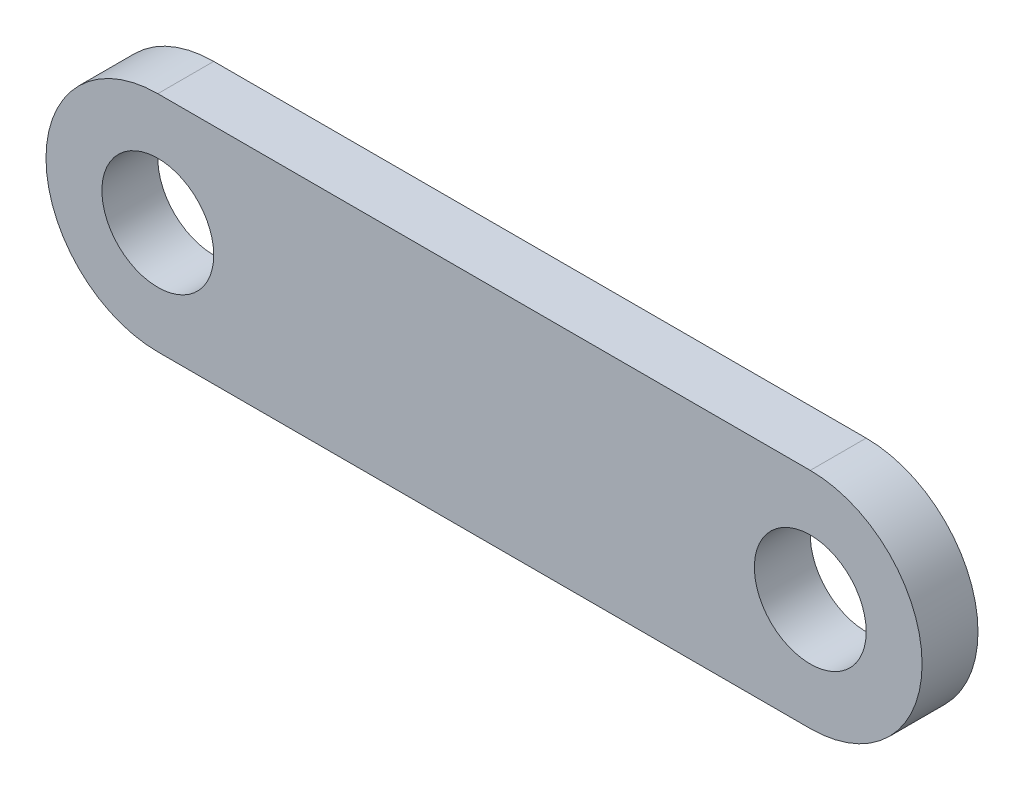
ISO-10303-21;
HEADER;
FILE_DESCRIPTION(('STEP AP214'),'2;1');
FILE_NAME('part.step','',(''),(''),'','','');
FILE_SCHEMA(('AUTOMOTIVE_DESIGN { 1 0 10303 214 1 1 1 1 }'));
ENDSEC;
DATA;
#1=APPLICATION_CONTEXT('core data for automotive mechanical design processes');
#2=APPLICATION_PROTOCOL_DEFINITION('international standard','automotive_design',2000,#1);
#3=PRODUCT_CONTEXT('',#1,'mechanical');
#4=PRODUCT('Part','Part','',(#3));
#5=PRODUCT_RELATED_PRODUCT_CATEGORY('part','',(#4));
#6=PRODUCT_DEFINITION_FORMATION('','',#4);
#7=PRODUCT_DEFINITION_CONTEXT('part definition',#1,'design');
#8=PRODUCT_DEFINITION('design','',#6,#7);
#9=PRODUCT_DEFINITION_SHAPE('','',#8);
#10=(LENGTH_UNIT() NAMED_UNIT(*) SI_UNIT(.MILLI.,.METRE.));
#11=(NAMED_UNIT(*) PLANE_ANGLE_UNIT() SI_UNIT($,.RADIAN.));
#12=(NAMED_UNIT(*) SI_UNIT($,.STERADIAN.) SOLID_ANGLE_UNIT());
#13=UNCERTAINTY_MEASURE_WITH_UNIT(LENGTH_MEASURE(1.E-05),#10,'distance_accuracy_value','');
#14=(GEOMETRIC_REPRESENTATION_CONTEXT(3) GLOBAL_UNCERTAINTY_ASSIGNED_CONTEXT((#13)) GLOBAL_UNIT_ASSIGNED_CONTEXT((#10,
#11,#12)) REPRESENTATION_CONTEXT('',''));
#15=CARTESIAN_POINT('',(0.,0.,0.));
#16=DIRECTION('',(0.,0.,1.));
#17=DIRECTION('',(1.,0.,0.));
#18=AXIS2_PLACEMENT_3D('',#15,#16,#17);
#19=CARTESIAN_POINT('',(5.835,0.,1.));
#20=DIRECTION('',(0.,0.,-1.));
#21=DIRECTION('',(-1.,0.,0.));
#22=AXIS2_PLACEMENT_3D('',#19,#20,#21);
#23=PLANE('',#22);
#24=CARTESIAN_POINT('',(5.835,0.,1.));
#25=DIRECTION('',(0.,0.,1.));
#26=DIRECTION('',(-1.,0.,0.));
#27=AXIS2_PLACEMENT_3D('',#24,#25,#26);
#28=CIRCLE('',#27,2.);
#29=CARTESIAN_POINT('',(5.835,-2.,1.));
#30=VERTEX_POINT('',#29);
#31=CARTESIAN_POINT('',(5.835,2.,1.));
#32=VERTEX_POINT('',#31);
#33=EDGE_CURVE('E95',#30,#32,#28,.T.);
#34=ORIENTED_EDGE('',*,*,#33,.T.);
#35=DIRECTION('',(-1.,0.,0.));
#36=VECTOR('',#35,1.);
#37=CARTESIAN_POINT('',(-5.835,2.,1.));
#38=LINE('',#37,#36);
#39=CARTESIAN_POINT('',(-5.835,2.,1.));
#40=VERTEX_POINT('',#39);
#41=EDGE_CURVE('E90',#32,#40,#38,.T.);
#42=ORIENTED_EDGE('',*,*,#41,.T.);
#43=CARTESIAN_POINT('',(-5.835,0.,1.));
#44=DIRECTION('',(0.,0.,1.));
#45=DIRECTION('',(1.,0.,0.));
#46=AXIS2_PLACEMENT_3D('',#43,#44,#45);
#47=CIRCLE('',#46,2.);
#48=CARTESIAN_POINT('',(-5.835,-2.,1.));
#49=VERTEX_POINT('',#48);
#50=EDGE_CURVE('E93',#40,#49,#47,.T.);
#51=ORIENTED_EDGE('',*,*,#50,.T.);
#52=DIRECTION('',(1.,0.,0.));
#53=VECTOR('',#52,1.);
#54=CARTESIAN_POINT('',(-5.835,-2.,1.));
#55=LINE('',#54,#53);
#56=EDGE_CURVE('E60',#49,#30,#55,.T.);
#57=ORIENTED_EDGE('',*,*,#56,.T.);
#58=EDGE_LOOP('',(#34,#42,#51,#57));
#59=FACE_BOUND('',#58,.T.);
#60=CARTESIAN_POINT('',(-5.835,0.,1.));
#61=DIRECTION('',(0.,0.,1.));
#62=DIRECTION('',(1.,0.,0.));
#63=AXIS2_PLACEMENT_3D('',#60,#61,#62);
#64=CIRCLE('',#63,1.);
#65=CARTESIAN_POINT('',(-4.835,0.,1.));
#66=VERTEX_POINT('',#65);
#67=EDGE_CURVE('E115',#66,#66,#64,.T.);
#68=ORIENTED_EDGE('',*,*,#67,.F.);
#69=EDGE_LOOP('',(#68));
#70=FACE_BOUND('',#69,.T.);
#71=CARTESIAN_POINT('',(5.835,0.,1.));
#72=DIRECTION('',(0.,0.,1.));
#73=DIRECTION('',(1.,0.,0.));
#74=AXIS2_PLACEMENT_3D('',#71,#72,#73);
#75=CIRCLE('',#74,1.);
#76=CARTESIAN_POINT('',(6.835,0.,1.));
#77=VERTEX_POINT('',#76);
#78=EDGE_CURVE('E137',#77,#77,#75,.T.);
#79=ORIENTED_EDGE('',*,*,#78,.F.);
#80=EDGE_LOOP('',(#79));
#81=FACE_BOUND('',#80,.T.);
#82=ADVANCED_FACE('F42',(#59,#70,#81),#23,.F.);
#83=CARTESIAN_POINT('',(5.835,0.,0.));
#84=DIRECTION('',(0.,0.,-1.));
#85=DIRECTION('',(-1.,0.,0.));
#86=AXIS2_PLACEMENT_3D('',#83,#84,#85);
#87=PLANE('',#86);
#88=CARTESIAN_POINT('',(-5.835,0.,0.));
#89=DIRECTION('',(0.,0.,1.));
#90=DIRECTION('',(1.,0.,0.));
#91=AXIS2_PLACEMENT_3D('',#88,#89,#90);
#92=CIRCLE('',#91,1.);
#93=CARTESIAN_POINT('',(-4.835,0.,0.));
#94=VERTEX_POINT('',#93);
#95=EDGE_CURVE('E133',#94,#94,#92,.T.);
#96=ORIENTED_EDGE('',*,*,#95,.T.);
#97=EDGE_LOOP('',(#96));
#98=FACE_BOUND('',#97,.T.);
#99=CARTESIAN_POINT('',(5.835,0.,0.));
#100=DIRECTION('',(0.,0.,1.));
#101=DIRECTION('',(-1.,0.,0.));
#102=AXIS2_PLACEMENT_3D('',#99,#100,#101);
#103=CIRCLE('',#102,2.);
#104=CARTESIAN_POINT('',(5.835,-2.,0.));
#105=VERTEX_POINT('',#104);
#106=CARTESIAN_POINT('',(5.835,2.,0.));
#107=VERTEX_POINT('',#106);
#108=EDGE_CURVE('E111',#105,#107,#103,.T.);
#109=ORIENTED_EDGE('',*,*,#108,.F.);
#110=DIRECTION('',(1.,0.,0.));
#111=VECTOR('',#110,1.);
#112=CARTESIAN_POINT('',(-5.835,-2.,0.));
#113=LINE('',#112,#111);
#114=CARTESIAN_POINT('',(-5.835,-2.,0.));
#115=VERTEX_POINT('',#114);
#116=EDGE_CURVE('E83',#115,#105,#113,.T.);
#117=ORIENTED_EDGE('',*,*,#116,.F.);
#118=CARTESIAN_POINT('',(-5.835,0.,0.));
#119=DIRECTION('',(0.,0.,1.));
#120=DIRECTION('',(1.,0.,0.));
#121=AXIS2_PLACEMENT_3D('',#118,#119,#120);
#122=CIRCLE('',#121,2.);
#123=CARTESIAN_POINT('',(-5.835,2.,0.));
#124=VERTEX_POINT('',#123);
#125=EDGE_CURVE('E77',#124,#115,#122,.T.);
#126=ORIENTED_EDGE('',*,*,#125,.F.);
#127=DIRECTION('',(-1.,0.,0.));
#128=VECTOR('',#127,1.);
#129=CARTESIAN_POINT('',(-5.835,2.,0.));
#130=LINE('',#129,#128);
#131=EDGE_CURVE('E100',#107,#124,#130,.T.);
#132=ORIENTED_EDGE('',*,*,#131,.F.);
#133=EDGE_LOOP('',(#109,#117,#126,#132));
#134=FACE_BOUND('',#133,.T.);
#135=CARTESIAN_POINT('',(5.835,0.,0.));
#136=DIRECTION('',(0.,0.,1.));
#137=DIRECTION('',(1.,0.,0.));
#138=AXIS2_PLACEMENT_3D('',#135,#136,#137);
#139=CIRCLE('',#138,1.);
#140=CARTESIAN_POINT('',(6.835,0.,0.));
#141=VERTEX_POINT('',#140);
#142=EDGE_CURVE('E141',#141,#141,#139,.T.);
#143=ORIENTED_EDGE('',*,*,#142,.T.);
#144=EDGE_LOOP('',(#143));
#145=FACE_BOUND('',#144,.T.);
#146=ADVANCED_FACE('F128',(#98,#134,#145),#87,.T.);
#147=CARTESIAN_POINT('',(5.835,0.,1.));
#148=DIRECTION('',(0.,0.,-1.));
#149=DIRECTION('',(-1.,0.,0.));
#150=AXIS2_PLACEMENT_3D('',#147,#148,#149);
#151=CYLINDRICAL_SURFACE('',#150,2.);
#152=ORIENTED_EDGE('',*,*,#108,.T.);
#153=DIRECTION('',(0.,0.,-1.));
#154=VECTOR('',#153,1.);
#155=CARTESIAN_POINT('',(5.835,2.,1.));
#156=LINE('',#155,#154);
#157=EDGE_CURVE('E11',#32,#107,#156,.T.);
#158=ORIENTED_EDGE('',*,*,#157,.F.);
#159=ORIENTED_EDGE('',*,*,#33,.F.);
#160=DIRECTION('',(0.,0.,-1.));
#161=VECTOR('',#160,1.);
#162=CARTESIAN_POINT('',(5.835,-2.,1.));
#163=LINE('',#162,#161);
#164=EDGE_CURVE('E107',#30,#105,#163,.T.);
#165=ORIENTED_EDGE('',*,*,#164,.T.);
#166=EDGE_LOOP('',(#152,#158,#159,#165));
#167=FACE_BOUND('',#166,.T.);
#168=ADVANCED_FACE('F44',(#167),#151,.T.);
#169=CARTESIAN_POINT('',(-5.835,2.,1.));
#170=DIRECTION('',(0.,-1.,0.));
#171=DIRECTION('',(0.,0.,-1.));
#172=AXIS2_PLACEMENT_3D('',#169,#170,#171);
#173=PLANE('',#172);
#174=ORIENTED_EDGE('',*,*,#131,.T.);
#175=DIRECTION('',(0.,0.,-1.));
#176=VECTOR('',#175,1.);
#177=CARTESIAN_POINT('',(-5.835,2.,1.));
#178=LINE('',#177,#176);
#179=EDGE_CURVE('E52',#40,#124,#178,.T.);
#180=ORIENTED_EDGE('',*,*,#179,.F.);
#181=ORIENTED_EDGE('',*,*,#41,.F.);
#182=ORIENTED_EDGE('',*,*,#157,.T.);
#183=EDGE_LOOP('',(#174,#180,#181,#182));
#184=FACE_BOUND('',#183,.T.);
#185=ADVANCED_FACE('F99',(#184),#173,.F.);
#186=CARTESIAN_POINT('',(-5.835,0.,1.));
#187=DIRECTION('',(0.,0.,-1.));
#188=DIRECTION('',(-1.,0.,0.));
#189=AXIS2_PLACEMENT_3D('',#186,#187,#188);
#190=CYLINDRICAL_SURFACE('',#189,2.);
#191=ORIENTED_EDGE('',*,*,#125,.T.);
#192=DIRECTION('',(0.,0.,-1.));
#193=VECTOR('',#192,1.);
#194=CARTESIAN_POINT('',(-5.835,-2.,1.));
#195=LINE('',#194,#193);
#196=EDGE_CURVE('E102',#49,#115,#195,.T.);
#197=ORIENTED_EDGE('',*,*,#196,.F.);
#198=ORIENTED_EDGE('',*,*,#50,.F.);
#199=ORIENTED_EDGE('',*,*,#179,.T.);
#200=EDGE_LOOP('',(#191,#197,#198,#199));
#201=FACE_BOUND('',#200,.T.);
#202=ADVANCED_FACE('F103',(#201),#190,.T.);
#203=CARTESIAN_POINT('',(-5.835,-2.,1.));
#204=DIRECTION('',(0.,1.,0.));
#205=DIRECTION('',(0.,0.,1.));
#206=AXIS2_PLACEMENT_3D('',#203,#204,#205);
#207=PLANE('',#206);
#208=ORIENTED_EDGE('',*,*,#116,.T.);
#209=ORIENTED_EDGE('',*,*,#164,.F.);
#210=ORIENTED_EDGE('',*,*,#56,.F.);
#211=ORIENTED_EDGE('',*,*,#196,.T.);
#212=EDGE_LOOP('',(#208,#209,#210,#211));
#213=FACE_BOUND('',#212,.T.);
#214=ADVANCED_FACE('F125',(#213),#207,.F.);
#215=CARTESIAN_POINT('',(-5.835,0.,1.));
#216=DIRECTION('',(0.,0.,-1.));
#217=DIRECTION('',(-1.,0.,0.));
#218=AXIS2_PLACEMENT_3D('',#215,#216,#217);
#219=CYLINDRICAL_SURFACE('',#218,1.);
#220=ORIENTED_EDGE('',*,*,#67,.T.);
#221=EDGE_LOOP('',(#220));
#222=FACE_BOUND('',#221,.T.);
#223=ORIENTED_EDGE('',*,*,#95,.F.);
#224=EDGE_LOOP('',(#223));
#225=FACE_BOUND('',#224,.T.);
#226=ADVANCED_FACE('F160',(#222,#225),#219,.F.);
#227=CARTESIAN_POINT('',(5.835,0.,1.));
#228=DIRECTION('',(0.,0.,-1.));
#229=DIRECTION('',(-1.,0.,0.));
#230=AXIS2_PLACEMENT_3D('',#227,#228,#229);
#231=CYLINDRICAL_SURFACE('',#230,1.);
#232=ORIENTED_EDGE('',*,*,#78,.T.);
#233=EDGE_LOOP('',(#232));
#234=FACE_BOUND('',#233,.T.);
#235=ORIENTED_EDGE('',*,*,#142,.F.);
#236=EDGE_LOOP('',(#235));
#237=FACE_BOUND('',#236,.T.);
#238=ADVANCED_FACE('F149',(#234,#237),#231,.F.);
#239=CLOSED_SHELL('',(#82,#146,#168,#185,#202,#214,#226,#238));
#240=MANIFOLD_SOLID_BREP('B2',#239);
#241=ADVANCED_BREP_SHAPE_REPRESENTATION('',(#18,#240),#14);
#242=SHAPE_DEFINITION_REPRESENTATION(#9,#241);
ENDSEC;
END-ISO-10303-21;
